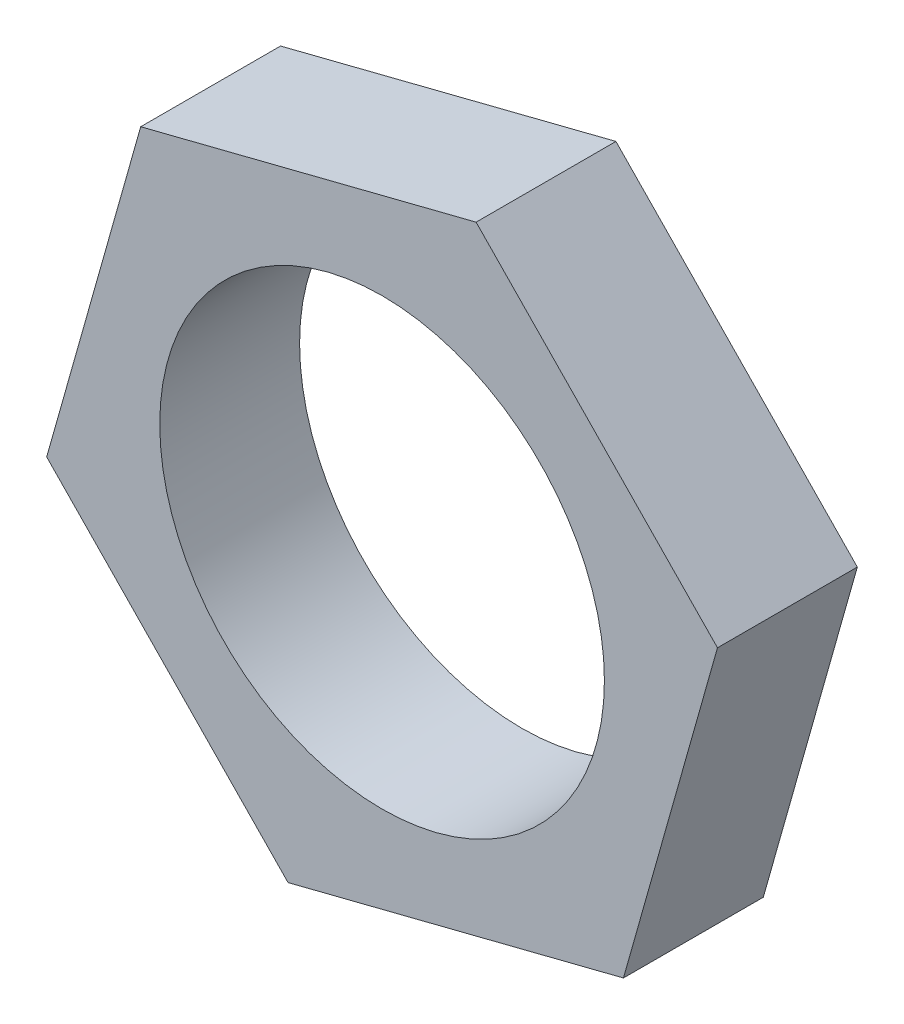
ISO-10303-21;
HEADER;
FILE_DESCRIPTION(('STEP AP214'),'2;1');
FILE_NAME('part.step','',(''),(''),'','','');
FILE_SCHEMA(('AUTOMOTIVE_DESIGN { 1 0 10303 214 1 1 1 1 }'));
ENDSEC;
DATA;
#1=APPLICATION_CONTEXT('core data for automotive mechanical design processes');
#2=APPLICATION_PROTOCOL_DEFINITION('international standard','automotive_design',2000,#1);
#3=PRODUCT_CONTEXT('',#1,'mechanical');
#4=PRODUCT('Part','Part','',(#3));
#5=PRODUCT_RELATED_PRODUCT_CATEGORY('part','',(#4));
#6=PRODUCT_DEFINITION_FORMATION('','',#4);
#7=PRODUCT_DEFINITION_CONTEXT('part definition',#1,'design');
#8=PRODUCT_DEFINITION('design','',#6,#7);
#9=PRODUCT_DEFINITION_SHAPE('','',#8);
#10=(LENGTH_UNIT() NAMED_UNIT(*) SI_UNIT(.MILLI.,.METRE.));
#11=(NAMED_UNIT(*) PLANE_ANGLE_UNIT() SI_UNIT($,.RADIAN.));
#12=(NAMED_UNIT(*) SI_UNIT($,.STERADIAN.) SOLID_ANGLE_UNIT());
#13=UNCERTAINTY_MEASURE_WITH_UNIT(LENGTH_MEASURE(1.E-05),#10,'distance_accuracy_value','');
#14=(GEOMETRIC_REPRESENTATION_CONTEXT(3) GLOBAL_UNCERTAINTY_ASSIGNED_CONTEXT((#13)) GLOBAL_UNIT_ASSIGNED_CONTEXT((#10,
#11,#12)) REPRESENTATION_CONTEXT('',''));
#15=CARTESIAN_POINT('',(0.,0.,0.));
#16=DIRECTION('',(0.,0.,1.));
#17=DIRECTION('',(1.,0.,0.));
#18=AXIS2_PLACEMENT_3D('',#15,#16,#17);
#19=CARTESIAN_POINT('',(0.,0.,2.));
#20=DIRECTION('',(0.,0.,1.));
#21=DIRECTION('',(1.,0.,0.));
#22=AXIS2_PLACEMENT_3D('',#19,#20,#21);
#23=PLANE('',#22);
#24=DIRECTION('',(0.697559990011051,-0.716526384954373,0.));
#25=VECTOR('',#24,1.);
#26=CARTESIAN_POINT('',(-4.79721061221333,-1.21669362488854,2.));
#27=LINE('',#26,#25);
#28=CARTESIAN_POINT('',(-4.79721061221333,-1.21669362488854,2.));
#29=VERTEX_POINT('',#28);
#30=CARTESIAN_POINT('',(-1.34491771833062,-4.76285306992532,2.));
#31=VERTEX_POINT('',#30);
#32=EDGE_CURVE('E136',#29,#31,#27,.T.);
#33=ORIENTED_EDGE('',*,*,#32,.T.);
#34=DIRECTION('',(0.969310046857841,0.245841479536003,0.));
#35=VECTOR('',#34,1.);
#36=CARTESIAN_POINT('',(-1.34491771833062,-4.76285306992532,2.));
#37=LINE('',#36,#35);
#38=CARTESIAN_POINT('',(3.45229289388271,-3.54615944503678,2.));
#39=VERTEX_POINT('',#38);
#40=EDGE_CURVE('E94',#31,#39,#37,.T.);
#41=ORIENTED_EDGE('',*,*,#40,.T.);
#42=DIRECTION('',(0.271750056846789,0.962367864490376,0.));
#43=VECTOR('',#42,1.);
#44=CARTESIAN_POINT('',(3.45229289388271,-3.54615944503678,2.));
#45=LINE('',#44,#43);
#46=CARTESIAN_POINT('',(4.79721061221333,1.21669362488853,2.));
#47=VERTEX_POINT('',#46);
#48=EDGE_CURVE('E107',#39,#47,#45,.T.);
#49=ORIENTED_EDGE('',*,*,#48,.T.);
#50=DIRECTION('',(-0.697559990011051,0.716526384954373,0.));
#51=VECTOR('',#50,1.);
#52=CARTESIAN_POINT('',(4.79721061221333,1.21669362488853,2.));
#53=LINE('',#52,#51);
#54=CARTESIAN_POINT('',(1.34491771833062,4.76285306992531,2.));
#55=VERTEX_POINT('',#54);
#56=EDGE_CURVE('E101',#47,#55,#53,.T.);
#57=ORIENTED_EDGE('',*,*,#56,.T.);
#58=DIRECTION('',(-0.96931004685784,-0.245841479536003,0.));
#59=VECTOR('',#58,1.);
#60=CARTESIAN_POINT('',(1.34491771833062,4.76285306992531,2.));
#61=LINE('',#60,#59);
#62=CARTESIAN_POINT('',(-3.45229289388271,3.54615944503678,2.));
#63=VERTEX_POINT('',#62);
#64=EDGE_CURVE('E105',#55,#63,#61,.T.);
#65=ORIENTED_EDGE('',*,*,#64,.T.);
#66=DIRECTION('',(-0.271750056846789,-0.962367864490376,0.));
#67=VECTOR('',#66,1.);
#68=CARTESIAN_POINT('',(-3.45229289388271,3.54615944503678,2.));
#69=LINE('',#68,#67);
#70=EDGE_CURVE('E57',#63,#29,#69,.T.);
#71=ORIENTED_EDGE('',*,*,#70,.T.);
#72=EDGE_LOOP('',(#33,#41,#49,#57,#65,#71));
#73=FACE_BOUND('',#72,.T.);
#74=CARTESIAN_POINT('',(0.,0.,2.));
#75=DIRECTION('',(0.,0.,1.));
#76=DIRECTION('',(1.,0.,0.));
#77=AXIS2_PLACEMENT_3D('',#74,#75,#76);
#78=CIRCLE('',#77,3.18);
#79=CARTESIAN_POINT('',(3.18,0.,2.));
#80=VERTEX_POINT('',#79);
#81=EDGE_CURVE('E129',#80,#80,#78,.T.);
#82=ORIENTED_EDGE('',*,*,#81,.F.);
#83=EDGE_LOOP('',(#82));
#84=FACE_BOUND('',#83,.T.);
#85=ADVANCED_FACE('F40',(#73,#84),#23,.T.);
#86=CARTESIAN_POINT('',(0.,0.,0.));
#87=DIRECTION('',(0.,0.,1.));
#88=DIRECTION('',(1.,0.,0.));
#89=AXIS2_PLACEMENT_3D('',#86,#87,#88);
#90=PLANE('',#89);
#91=DIRECTION('',(0.697559990011051,-0.716526384954373,0.));
#92=VECTOR('',#91,1.);
#93=CARTESIAN_POINT('',(-4.79721061221333,-1.21669362488854,0.));
#94=LINE('',#93,#92);
#95=CARTESIAN_POINT('',(-4.79721061221333,-1.21669362488854,0.));
#96=VERTEX_POINT('',#95);
#97=CARTESIAN_POINT('',(-1.34491771833062,-4.76285306992532,0.));
#98=VERTEX_POINT('',#97);
#99=EDGE_CURVE('E125',#96,#98,#94,.T.);
#100=ORIENTED_EDGE('',*,*,#99,.F.);
#101=DIRECTION('',(-0.271750056846789,-0.962367864490376,0.));
#102=VECTOR('',#101,1.);
#103=CARTESIAN_POINT('',(-3.45229289388271,3.54615944503678,0.));
#104=LINE('',#103,#102);
#105=CARTESIAN_POINT('',(-3.45229289388271,3.54615944503678,0.));
#106=VERTEX_POINT('',#105);
#107=EDGE_CURVE('E86',#106,#96,#104,.T.);
#108=ORIENTED_EDGE('',*,*,#107,.F.);
#109=DIRECTION('',(-0.96931004685784,-0.245841479536003,0.));
#110=VECTOR('',#109,1.);
#111=CARTESIAN_POINT('',(1.34491771833062,4.76285306992531,0.));
#112=LINE('',#111,#110);
#113=CARTESIAN_POINT('',(1.34491771833062,4.76285306992531,0.));
#114=VERTEX_POINT('',#113);
#115=EDGE_CURVE('E80',#114,#106,#112,.T.);
#116=ORIENTED_EDGE('',*,*,#115,.F.);
#117=DIRECTION('',(-0.697559990011051,0.716526384954373,0.));
#118=VECTOR('',#117,1.);
#119=CARTESIAN_POINT('',(4.79721061221333,1.21669362488853,0.));
#120=LINE('',#119,#118);
#121=CARTESIAN_POINT('',(4.79721061221333,1.21669362488853,0.));
#122=VERTEX_POINT('',#121);
#123=EDGE_CURVE('E115',#122,#114,#120,.T.);
#124=ORIENTED_EDGE('',*,*,#123,.F.);
#125=DIRECTION('',(0.271750056846789,0.962367864490376,0.));
#126=VECTOR('',#125,1.);
#127=CARTESIAN_POINT('',(3.45229289388271,-3.54615944503678,0.));
#128=LINE('',#127,#126);
#129=CARTESIAN_POINT('',(3.45229289388271,-3.54615944503678,0.));
#130=VERTEX_POINT('',#129);
#131=EDGE_CURVE('E131',#130,#122,#128,.T.);
#132=ORIENTED_EDGE('',*,*,#131,.F.);
#133=DIRECTION('',(0.969310046857841,0.245841479536003,0.));
#134=VECTOR('',#133,1.);
#135=CARTESIAN_POINT('',(-1.34491771833062,-4.76285306992532,0.));
#136=LINE('',#135,#134);
#137=EDGE_CURVE('E128',#98,#130,#136,.T.);
#138=ORIENTED_EDGE('',*,*,#137,.F.);
#139=EDGE_LOOP('',(#100,#108,#116,#124,#132,#138));
#140=FACE_BOUND('',#139,.T.);
#141=CARTESIAN_POINT('',(0.,0.,0.));
#142=DIRECTION('',(0.,0.,1.));
#143=DIRECTION('',(1.,0.,0.));
#144=AXIS2_PLACEMENT_3D('',#141,#142,#143);
#145=CIRCLE('',#144,3.18);
#146=CARTESIAN_POINT('',(3.18,0.,0.));
#147=VERTEX_POINT('',#146);
#148=EDGE_CURVE('E235',#147,#147,#145,.T.);
#149=ORIENTED_EDGE('',*,*,#148,.T.);
#150=EDGE_LOOP('',(#149));
#151=FACE_BOUND('',#150,.T.);
#152=ADVANCED_FACE('F145',(#140,#151),#90,.F.);
#153=CARTESIAN_POINT('',(-4.79721061221333,-1.21669362488854,2.));
#154=DIRECTION('',(0.716526384954373,0.697559990011052,0.));
#155=DIRECTION('',(-0.697559990011051,0.716526384954373,0.));
#156=AXIS2_PLACEMENT_3D('',#153,#154,#155);
#157=PLANE('',#156);
#158=ORIENTED_EDGE('',*,*,#99,.T.);
#159=DIRECTION('',(0.,0.,-1.));
#160=VECTOR('',#159,1.);
#161=CARTESIAN_POINT('',(-1.34491771833062,-4.76285306992532,2.));
#162=LINE('',#161,#160);
#163=EDGE_CURVE('E11',#31,#98,#162,.T.);
#164=ORIENTED_EDGE('',*,*,#163,.F.);
#165=ORIENTED_EDGE('',*,*,#32,.F.);
#166=DIRECTION('',(0.,0.,-1.));
#167=VECTOR('',#166,1.);
#168=CARTESIAN_POINT('',(-4.79721061221333,-1.21669362488854,2.));
#169=LINE('',#168,#167);
#170=EDGE_CURVE('E121',#29,#96,#169,.T.);
#171=ORIENTED_EDGE('',*,*,#170,.T.);
#172=EDGE_LOOP('',(#158,#164,#165,#171));
#173=FACE_BOUND('',#172,.T.);
#174=ADVANCED_FACE('F42',(#173),#157,.F.);
#175=CARTESIAN_POINT('',(-1.34491771833062,-4.76285306992532,2.));
#176=DIRECTION('',(-0.245841479536003,0.969310046857841,0.));
#177=DIRECTION('',(-0.969310046857841,-0.245841479536003,0.));
#178=AXIS2_PLACEMENT_3D('',#175,#176,#177);
#179=PLANE('',#178);
#180=ORIENTED_EDGE('',*,*,#137,.T.);
#181=DIRECTION('',(0.,0.,-1.));
#182=VECTOR('',#181,1.);
#183=CARTESIAN_POINT('',(3.45229289388271,-3.54615944503678,2.));
#184=LINE('',#183,#182);
#185=EDGE_CURVE('E49',#39,#130,#184,.T.);
#186=ORIENTED_EDGE('',*,*,#185,.F.);
#187=ORIENTED_EDGE('',*,*,#40,.F.);
#188=ORIENTED_EDGE('',*,*,#163,.T.);
#189=EDGE_LOOP('',(#180,#186,#187,#188));
#190=FACE_BOUND('',#189,.T.);
#191=ADVANCED_FACE('F170',(#190),#179,.F.);
#192=CARTESIAN_POINT('',(3.45229289388271,-3.54615944503678,2.));
#193=DIRECTION('',(-0.962367864490376,0.271750056846789,0.));
#194=DIRECTION('',(-0.271750056846789,-0.962367864490376,0.));
#195=AXIS2_PLACEMENT_3D('',#192,#193,#194);
#196=PLANE('',#195);
#197=ORIENTED_EDGE('',*,*,#131,.T.);
#198=DIRECTION('',(0.,0.,-1.));
#199=VECTOR('',#198,1.);
#200=CARTESIAN_POINT('',(4.79721061221333,1.21669362488853,2.));
#201=LINE('',#200,#199);
#202=EDGE_CURVE('E116',#47,#122,#201,.T.);
#203=ORIENTED_EDGE('',*,*,#202,.F.);
#204=ORIENTED_EDGE('',*,*,#48,.F.);
#205=ORIENTED_EDGE('',*,*,#185,.T.);
#206=EDGE_LOOP('',(#197,#203,#204,#205));
#207=FACE_BOUND('',#206,.T.);
#208=ADVANCED_FACE('F142',(#207),#196,.F.);
#209=CARTESIAN_POINT('',(4.79721061221333,1.21669362488853,2.));
#210=DIRECTION('',(-0.716526384954373,-0.697559990011051,0.));
#211=DIRECTION('',(0.697559990011051,-0.716526384954373,0.));
#212=AXIS2_PLACEMENT_3D('',#209,#210,#211);
#213=PLANE('',#212);
#214=ORIENTED_EDGE('',*,*,#123,.T.);
#215=DIRECTION('',(0.,0.,-1.));
#216=VECTOR('',#215,1.);
#217=CARTESIAN_POINT('',(1.34491771833062,4.76285306992531,2.));
#218=LINE('',#217,#216);
#219=EDGE_CURVE('E112',#55,#114,#218,.T.);
#220=ORIENTED_EDGE('',*,*,#219,.F.);
#221=ORIENTED_EDGE('',*,*,#56,.F.);
#222=ORIENTED_EDGE('',*,*,#202,.T.);
#223=EDGE_LOOP('',(#214,#220,#221,#222));
#224=FACE_BOUND('',#223,.T.);
#225=ADVANCED_FACE('F113',(#224),#213,.F.);
#226=CARTESIAN_POINT('',(1.34491771833062,4.76285306992531,2.));
#227=DIRECTION('',(0.245841479536003,-0.96931004685784,0.));
#228=DIRECTION('',(0.969310046857841,0.245841479536003,0.));
#229=AXIS2_PLACEMENT_3D('',#226,#227,#228);
#230=PLANE('',#229);
#231=ORIENTED_EDGE('',*,*,#115,.T.);
#232=DIRECTION('',(0.,0.,-1.));
#233=VECTOR('',#232,1.);
#234=CARTESIAN_POINT('',(-3.45229289388271,3.54615944503678,2.));
#235=LINE('',#234,#233);
#236=EDGE_CURVE('E117',#63,#106,#235,.T.);
#237=ORIENTED_EDGE('',*,*,#236,.F.);
#238=ORIENTED_EDGE('',*,*,#64,.F.);
#239=ORIENTED_EDGE('',*,*,#219,.T.);
#240=EDGE_LOOP('',(#231,#237,#238,#239));
#241=FACE_BOUND('',#240,.T.);
#242=ADVANCED_FACE('F119',(#241),#230,.F.);
#243=CARTESIAN_POINT('',(-3.45229289388271,3.54615944503678,2.));
#244=DIRECTION('',(0.962367864490376,-0.271750056846789,0.));
#245=DIRECTION('',(0.271750056846789,0.962367864490376,0.));
#246=AXIS2_PLACEMENT_3D('',#243,#244,#245);
#247=PLANE('',#246);
#248=ORIENTED_EDGE('',*,*,#107,.T.);
#249=ORIENTED_EDGE('',*,*,#170,.F.);
#250=ORIENTED_EDGE('',*,*,#70,.F.);
#251=ORIENTED_EDGE('',*,*,#236,.T.);
#252=EDGE_LOOP('',(#248,#249,#250,#251));
#253=FACE_BOUND('',#252,.T.);
#254=ADVANCED_FACE('F150',(#253),#247,.F.);
#255=CARTESIAN_POINT('',(0.,0.,2.));
#256=DIRECTION('',(0.,0.,-1.));
#257=DIRECTION('',(-1.,0.,0.));
#258=AXIS2_PLACEMENT_3D('',#255,#256,#257);
#259=CYLINDRICAL_SURFACE('',#258,3.18);
#260=ORIENTED_EDGE('',*,*,#81,.T.);
#261=EDGE_LOOP('',(#260));
#262=FACE_BOUND('',#261,.T.);
#263=ORIENTED_EDGE('',*,*,#148,.F.);
#264=EDGE_LOOP('',(#263));
#265=FACE_BOUND('',#264,.T.);
#266=ADVANCED_FACE('F152',(#262,#265),#259,.F.);
#267=CLOSED_SHELL('',(#85,#152,#174,#191,#208,#225,#242,#254,#266));
#268=MANIFOLD_SOLID_BREP('B2',#267);
#269=ADVANCED_BREP_SHAPE_REPRESENTATION('',(#18,#268),#14);
#270=SHAPE_DEFINITION_REPRESENTATION(#9,#269);
ENDSEC;
END-ISO-10303-21;
